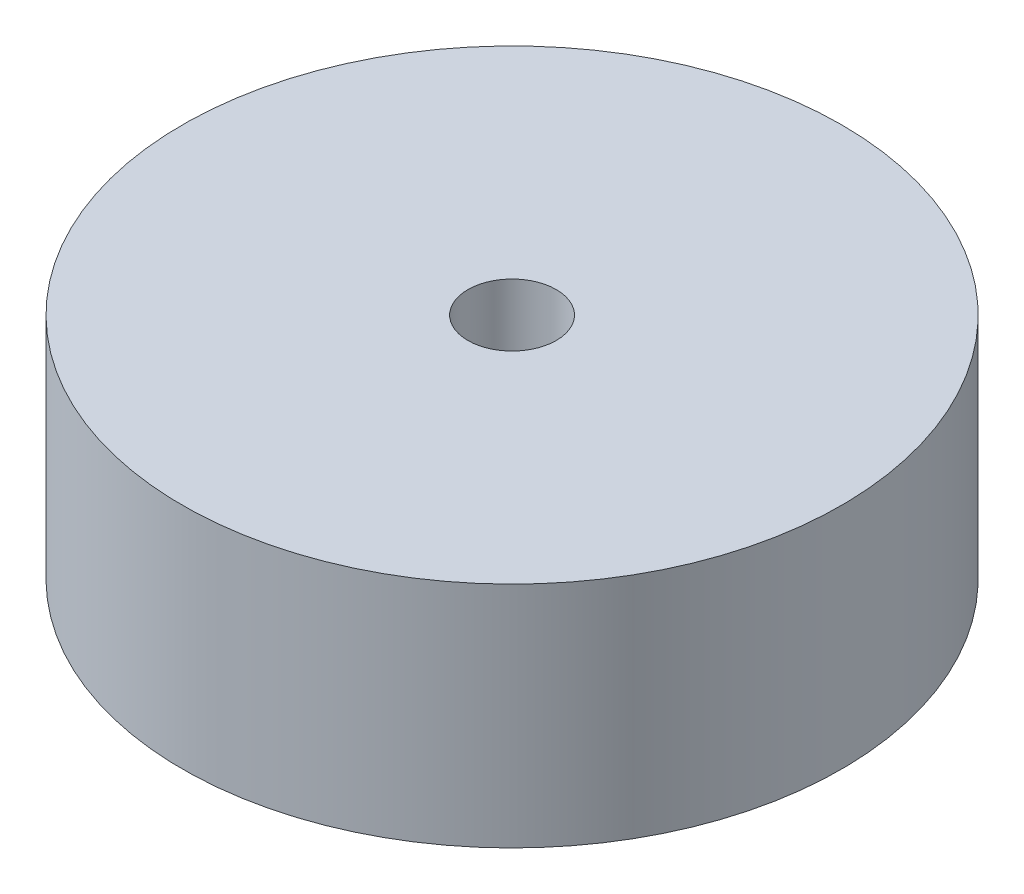
ISO-10303-21;
HEADER;
FILE_DESCRIPTION(('STEP AP214'),'2;1');
FILE_NAME('part.step','',(''),(''),'','','');
FILE_SCHEMA(('AUTOMOTIVE_DESIGN { 1 0 10303 214 1 1 1 1 }'));
ENDSEC;
DATA;
#1=APPLICATION_CONTEXT('core data for automotive mechanical design processes');
#2=APPLICATION_PROTOCOL_DEFINITION('international standard','automotive_design',2000,#1);
#3=PRODUCT_CONTEXT('',#1,'mechanical');
#4=PRODUCT('Part','Part','',(#3));
#5=PRODUCT_RELATED_PRODUCT_CATEGORY('part','',(#4));
#6=PRODUCT_DEFINITION_FORMATION('','',#4);
#7=PRODUCT_DEFINITION_CONTEXT('part definition',#1,'design');
#8=PRODUCT_DEFINITION('design','',#6,#7);
#9=PRODUCT_DEFINITION_SHAPE('','',#8);
#10=(LENGTH_UNIT() NAMED_UNIT(*) SI_UNIT(.MILLI.,.METRE.));
#11=(NAMED_UNIT(*) PLANE_ANGLE_UNIT() SI_UNIT($,.RADIAN.));
#12=(NAMED_UNIT(*) SI_UNIT($,.STERADIAN.) SOLID_ANGLE_UNIT());
#13=UNCERTAINTY_MEASURE_WITH_UNIT(LENGTH_MEASURE(1.E-05),#10,'distance_accuracy_value','');
#14=(GEOMETRIC_REPRESENTATION_CONTEXT(3) GLOBAL_UNCERTAINTY_ASSIGNED_CONTEXT((#13)) GLOBAL_UNIT_ASSIGNED_CONTEXT((#10,
#11,#12)) REPRESENTATION_CONTEXT('',''));
#15=CARTESIAN_POINT('',(0.,0.,0.));
#16=DIRECTION('',(0.,0.,1.));
#17=DIRECTION('',(1.,0.,0.));
#18=AXIS2_PLACEMENT_3D('',#15,#16,#17);
#19=CARTESIAN_POINT('',(0.,13.208,0.));
#20=DIRECTION('',(0.,-1.,0.));
#21=DIRECTION('',(0.,0.,-1.));
#22=AXIS2_PLACEMENT_3D('',#19,#20,#21);
#23=CYLINDRICAL_SURFACE('',#22,19.05);
#24=CARTESIAN_POINT('',(0.,13.208,0.));
#25=DIRECTION('',(0.,1.,0.));
#26=DIRECTION('',(0.,0.,1.));
#27=AXIS2_PLACEMENT_3D('',#24,#25,#26);
#28=CIRCLE('',#27,19.05);
#29=CARTESIAN_POINT('',(0.,13.208,-19.05));
#30=VERTEX_POINT('',#29);
#31=EDGE_CURVE('E10',#30,#30,#28,.T.);
#32=CARTESIAN_POINT('',(0.,0.,0.));
#33=DIRECTION('',(0.,1.,0.));
#34=DIRECTION('',(0.,0.,1.));
#35=AXIS2_PLACEMENT_3D('',#32,#33,#34);
#36=CIRCLE('',#35,19.05);
#37=CARTESIAN_POINT('',(0.,0.,-19.05));
#38=VERTEX_POINT('',#37);
#39=EDGE_CURVE('E42',#38,#38,#36,.T.);
#40=CARTESIAN_POINT('',(0.,13.208,-19.05));
#41=CARTESIAN_POINT('',(0.,13.0704166666667,-19.05));
#42=CARTESIAN_POINT('',(0.,12.9328333333333,-19.05));
#43=CARTESIAN_POINT('',(0.,12.6576666666667,-19.05));
#44=CARTESIAN_POINT('',(0.,12.5200833333333,-19.05));
#45=CARTESIAN_POINT('',(0.,12.2449166666667,-19.05));
#46=CARTESIAN_POINT('',(0.,12.1073333333333,-19.05));
#47=CARTESIAN_POINT('',(0.,11.8321666666667,-19.05));
#48=CARTESIAN_POINT('',(0.,11.6945833333333,-19.05));
#49=CARTESIAN_POINT('',(0.,11.4194166666667,-19.05));
#50=CARTESIAN_POINT('',(0.,11.2818333333333,-19.05));
#51=CARTESIAN_POINT('',(0.,11.0066666666667,-19.05));
#52=CARTESIAN_POINT('',(0.,10.8690833333333,-19.05));
#53=CARTESIAN_POINT('',(0.,10.5939166666667,-19.05));
#54=CARTESIAN_POINT('',(0.,10.4563333333333,-19.05));
#55=CARTESIAN_POINT('',(0.,10.1811666666667,-19.05));
#56=CARTESIAN_POINT('',(0.,10.0435833333333,-19.05));
#57=CARTESIAN_POINT('',(0.,9.76841666666667,-19.05));
#58=CARTESIAN_POINT('',(0.,9.63083333333333,-19.05));
#59=CARTESIAN_POINT('',(0.,9.35566666666666,-19.05));
#60=CARTESIAN_POINT('',(0.,9.21808333333333,-19.05));
#61=CARTESIAN_POINT('',(0.,8.94291666666667,-19.05));
#62=CARTESIAN_POINT('',(0.,8.80533333333333,-19.05));
#63=CARTESIAN_POINT('',(0.,8.53016666666666,-19.05));
#64=CARTESIAN_POINT('',(0.,8.39258333333333,-19.05));
#65=CARTESIAN_POINT('',(0.,8.11741666666667,-19.05));
#66=CARTESIAN_POINT('',(0.,7.97983333333333,-19.05));
#67=CARTESIAN_POINT('',(0.,7.70466666666667,-19.05));
#68=CARTESIAN_POINT('',(0.,7.56708333333333,-19.05));
#69=CARTESIAN_POINT('',(0.,7.29191666666667,-19.05));
#70=CARTESIAN_POINT('',(0.,7.15433333333333,-19.05));
#71=CARTESIAN_POINT('',(0.,6.87916666666667,-19.05));
#72=CARTESIAN_POINT('',(0.,6.74158333333333,-19.05));
#73=CARTESIAN_POINT('',(0.,6.46641666666667,-19.05));
#74=CARTESIAN_POINT('',(0.,6.32883333333333,-19.05));
#75=CARTESIAN_POINT('',(0.,6.05366666666667,-19.05));
#76=CARTESIAN_POINT('',(0.,5.91608333333333,-19.05));
#77=CARTESIAN_POINT('',(0.,5.64091666666667,-19.05));
#78=CARTESIAN_POINT('',(0.,5.50333333333333,-19.05));
#79=CARTESIAN_POINT('',(0.,5.22816666666667,-19.05));
#80=CARTESIAN_POINT('',(0.,5.09058333333333,-19.05));
#81=CARTESIAN_POINT('',(0.,4.81541666666667,-19.05));
#82=CARTESIAN_POINT('',(0.,4.67783333333333,-19.05));
#83=CARTESIAN_POINT('',(0.,4.40266666666667,-19.05));
#84=CARTESIAN_POINT('',(0.,4.26508333333333,-19.05));
#85=CARTESIAN_POINT('',(0.,3.98991666666667,-19.05));
#86=CARTESIAN_POINT('',(0.,3.85233333333333,-19.05));
#87=CARTESIAN_POINT('',(0.,3.57716666666667,-19.05));
#88=CARTESIAN_POINT('',(0.,3.43958333333333,-19.05));
#89=CARTESIAN_POINT('',(0.,3.16441666666667,-19.05));
#90=CARTESIAN_POINT('',(0.,3.02683333333333,-19.05));
#91=CARTESIAN_POINT('',(0.,2.75166666666667,-19.05));
#92=CARTESIAN_POINT('',(0.,2.61408333333333,-19.05));
#93=CARTESIAN_POINT('',(0.,2.33891666666667,-19.05));
#94=CARTESIAN_POINT('',(0.,2.20133333333333,-19.05));
#95=CARTESIAN_POINT('',(0.,1.92616666666667,-19.05));
#96=CARTESIAN_POINT('',(0.,1.78858333333333,-19.05));
#97=CARTESIAN_POINT('',(0.,1.51341666666667,-19.05));
#98=CARTESIAN_POINT('',(0.,1.37583333333333,-19.05));
#99=CARTESIAN_POINT('',(0.,1.10066666666667,-19.05));
#100=CARTESIAN_POINT('',(0.,0.963083333333333,-19.05));
#101=CARTESIAN_POINT('',(0.,0.687916666666667,-19.05));
#102=CARTESIAN_POINT('',(0.,0.550333333333333,-19.05));
#103=CARTESIAN_POINT('',(0.,0.275166666666667,-19.05));
#104=CARTESIAN_POINT('',(0.,0.137583333333333,-19.05));
#105=CARTESIAN_POINT('',(0.,0.,-19.05));
#106=B_SPLINE_CURVE_WITH_KNOTS('',3,(#40,#41,#42,#43,#44,#45,#46,#47,#48,#49,#50,#51,#52,#53,
#54,#55,#56,#57,#58,#59,#60,#61,#62,#63,#64,#65,#66,#67,#68,#69,#70,#71,#72,#73,#74,#75,#76,#77,
#78,#79,#80,#81,#82,#83,#84,#85,#86,#87,#88,#89,#90,#91,#92,#93,#94,#95,#96,#97,#98,#99,#100,
#101,#102,#103,#104,#105),.UNSPECIFIED.,.F.,.F.,(4,2,2,2,2,2,2,2,2,2,2,2,2,2,2,2,2,2,2,2,2,2,2,
2,2,2,2,2,2,2,2,2,4),(0.,0.412750000000002,0.825500000000002,1.23825,1.651,2.06375,2.4765,
2.88925,3.302,3.71475,4.1275,4.54025,4.953,5.36575,5.7785,6.19125,6.604,7.01675,7.4295,7.84225,
8.255,8.66775,9.0805,9.49325,9.906,10.31875,10.7315,11.14425,11.557,11.96975,12.3825,12.79525,
13.208),.UNSPECIFIED.);
#107=EDGE_CURVE('BSEAM35',#30,#38,#106,.T.);
#108=ORIENTED_EDGE('',*,*,#31,.F.);
#109=ORIENTED_EDGE('',*,*,#39,.T.);
#110=ORIENTED_EDGE('',*,*,#107,.T.);
#111=ORIENTED_EDGE('',*,*,#107,.F.);
#112=EDGE_LOOP('',(#108,#110,#109,#111));
#113=FACE_BOUND('',#112,.T.);
#114=ADVANCED_FACE('F35',(#113),#23,.T.);
#115=CARTESIAN_POINT('',(0.,13.208,0.));
#116=DIRECTION('',(0.,1.,0.));
#117=DIRECTION('',(0.,0.,1.));
#118=AXIS2_PLACEMENT_3D('',#115,#116,#117);
#119=PLANE('',#118);
#120=CARTESIAN_POINT('',(0.,13.208,0.));
#121=DIRECTION('',(0.,1.,0.));
#122=DIRECTION('',(0.,0.,1.));
#123=AXIS2_PLACEMENT_3D('',#120,#121,#122);
#124=CIRCLE('',#123,2.5527);
#125=CARTESIAN_POINT('',(0.,13.208,2.5527));
#126=VERTEX_POINT('',#125);
#127=EDGE_CURVE('E38',#126,#126,#124,.T.);
#128=ORIENTED_EDGE('',*,*,#127,.F.);
#129=EDGE_LOOP('',(#128));
#130=FACE_BOUND('',#129,.T.);
#131=ORIENTED_EDGE('',*,*,#31,.T.);
#132=EDGE_LOOP('',(#131));
#133=FACE_BOUND('',#132,.T.);
#134=ADVANCED_FACE('F57',(#130,#133),#119,.T.);
#135=CARTESIAN_POINT('',(0.,0.,0.));
#136=DIRECTION('',(0.,1.,0.));
#137=DIRECTION('',(0.,0.,1.));
#138=AXIS2_PLACEMENT_3D('',#135,#136,#137);
#139=PLANE('',#138);
#140=CARTESIAN_POINT('',(0.,0.,0.));
#141=DIRECTION('',(0.,-1.,0.));
#142=DIRECTION('',(0.,0.,-1.));
#143=AXIS2_PLACEMENT_3D('',#140,#141,#142);
#144=CIRCLE('',#143,2.5527);
#145=CARTESIAN_POINT('',(0.,0.,-2.5527));
#146=VERTEX_POINT('',#145);
#147=EDGE_CURVE('E48',#146,#146,#144,.T.);
#148=ORIENTED_EDGE('',*,*,#147,.F.);
#149=EDGE_LOOP('',(#148));
#150=FACE_BOUND('',#149,.T.);
#151=ORIENTED_EDGE('',*,*,#39,.F.);
#152=EDGE_LOOP('',(#151));
#153=FACE_BOUND('',#152,.T.);
#154=ADVANCED_FACE('F59',(#150,#153),#139,.F.);
#155=CARTESIAN_POINT('',(0.,0.,0.));
#156=DIRECTION('',(0.,-1.,0.));
#157=DIRECTION('',(0.,0.,-1.));
#158=AXIS2_PLACEMENT_3D('',#155,#156,#157);
#159=CYLINDRICAL_SURFACE('',#158,2.5527);
#160=ORIENTED_EDGE('',*,*,#127,.T.);
#161=EDGE_LOOP('',(#160));
#162=FACE_BOUND('',#161,.T.);
#163=ORIENTED_EDGE('',*,*,#147,.T.);
#164=EDGE_LOOP('',(#163));
#165=FACE_BOUND('',#164,.T.);
#166=ADVANCED_FACE('F55',(#162,#165),#159,.F.);
#167=CLOSED_SHELL('',(#114,#134,#154,#166));
#168=MANIFOLD_SOLID_BREP('B2',#167);
#169=ADVANCED_BREP_SHAPE_REPRESENTATION('',(#18,#168),#14);
#170=SHAPE_DEFINITION_REPRESENTATION(#9,#169);
ENDSEC;
END-ISO-10303-21;
